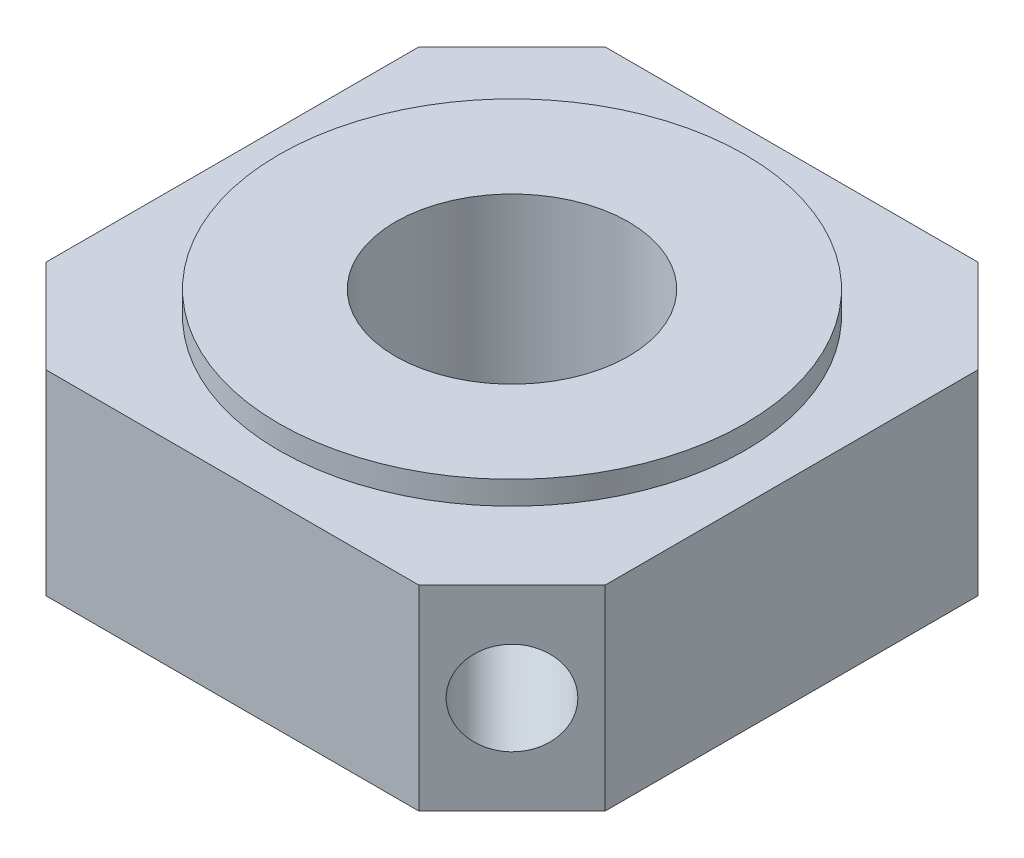
ISO-10303-21;
HEADER;
FILE_DESCRIPTION(('STEP AP214'),'2;1');
FILE_NAME('part.step','',(''),(''),'','','');
FILE_SCHEMA(('AUTOMOTIVE_DESIGN { 1 0 10303 214 1 1 1 1 }'));
ENDSEC;
DATA;
#1=APPLICATION_CONTEXT('core data for automotive mechanical design processes');
#2=APPLICATION_PROTOCOL_DEFINITION('international standard','automotive_design',2000,#1);
#3=PRODUCT_CONTEXT('',#1,'mechanical');
#4=PRODUCT('Part','Part','',(#3));
#5=PRODUCT_RELATED_PRODUCT_CATEGORY('part','',(#4));
#6=PRODUCT_DEFINITION_FORMATION('','',#4);
#7=PRODUCT_DEFINITION_CONTEXT('part definition',#1,'design');
#8=PRODUCT_DEFINITION('design','',#6,#7);
#9=PRODUCT_DEFINITION_SHAPE('','',#8);
#10=(LENGTH_UNIT() NAMED_UNIT(*) SI_UNIT(.MILLI.,.METRE.));
#11=(NAMED_UNIT(*) PLANE_ANGLE_UNIT() SI_UNIT($,.RADIAN.));
#12=(NAMED_UNIT(*) SI_UNIT($,.STERADIAN.) SOLID_ANGLE_UNIT());
#13=UNCERTAINTY_MEASURE_WITH_UNIT(LENGTH_MEASURE(1.E-05),#10,'distance_accuracy_value','');
#14=(GEOMETRIC_REPRESENTATION_CONTEXT(3) GLOBAL_UNCERTAINTY_ASSIGNED_CONTEXT((#13)) GLOBAL_UNIT_ASSIGNED_CONTEXT((#10,
#11,#12)) REPRESENTATION_CONTEXT('',''));
#15=CARTESIAN_POINT('',(0.,0.,0.));
#16=DIRECTION('',(0.,0.,1.));
#17=DIRECTION('',(1.,0.,0.));
#18=AXIS2_PLACEMENT_3D('',#15,#16,#17);
#19=CARTESIAN_POINT('',(-4.,4.2,-6.));
#20=DIRECTION('',(0.,0.,1.));
#21=DIRECTION('',(1.,0.,0.));
#22=AXIS2_PLACEMENT_3D('',#19,#20,#21);
#23=PLANE('',#22);
#24=DIRECTION('',(-1.,0.,0.));
#25=VECTOR('',#24,1.);
#26=CARTESIAN_POINT('',(-4.,0.,-6.));
#27=LINE('',#26,#25);
#28=CARTESIAN_POINT('',(4.,0.,-6.));
#29=VERTEX_POINT('',#28);
#30=CARTESIAN_POINT('',(-4.,0.,-6.));
#31=VERTEX_POINT('',#30);
#32=EDGE_CURVE('E142',#29,#31,#27,.T.);
#33=ORIENTED_EDGE('',*,*,#32,.T.);
#34=DIRECTION('',(0.,-1.,0.));
#35=VECTOR('',#34,1.);
#36=CARTESIAN_POINT('',(-4.,4.2,-6.));
#37=LINE('',#36,#35);
#38=CARTESIAN_POINT('',(-4.,4.2,-6.));
#39=VERTEX_POINT('',#38);
#40=EDGE_CURVE('E42',#39,#31,#37,.T.);
#41=ORIENTED_EDGE('',*,*,#40,.F.);
#42=DIRECTION('',(-1.,0.,0.));
#43=VECTOR('',#42,1.);
#44=CARTESIAN_POINT('',(-4.,4.2,-6.));
#45=LINE('',#44,#43);
#46=CARTESIAN_POINT('',(4.,4.2,-6.));
#47=VERTEX_POINT('',#46);
#48=EDGE_CURVE('E165',#47,#39,#45,.T.);
#49=ORIENTED_EDGE('',*,*,#48,.F.);
#50=DIRECTION('',(0.,-1.,0.));
#51=VECTOR('',#50,1.);
#52=CARTESIAN_POINT('',(4.,4.2,-6.));
#53=LINE('',#52,#51);
#54=EDGE_CURVE('E138',#47,#29,#53,.T.);
#55=ORIENTED_EDGE('',*,*,#54,.T.);
#56=EDGE_LOOP('',(#33,#41,#49,#55));
#57=FACE_BOUND('',#56,.T.);
#58=ADVANCED_FACE('F39',(#57),#23,.F.);
#59=CARTESIAN_POINT('',(-4.,4.2,-6.));
#60=DIRECTION('',(0.707106781186548,0.,0.707106781186548));
#61=DIRECTION('',(0.707106781186548,0.,-0.707106781186548));
#62=AXIS2_PLACEMENT_3D('',#59,#60,#61);
#63=PLANE('',#62);
#64=DIRECTION('',(-0.707106781186548,0.,0.707106781186548));
#65=VECTOR('',#64,1.);
#66=CARTESIAN_POINT('',(-4.,0.,-6.));
#67=LINE('',#66,#65);
#68=CARTESIAN_POINT('',(-6.,0.,-4.));
#69=VERTEX_POINT('',#68);
#70=EDGE_CURVE('E146',#31,#69,#67,.T.);
#71=ORIENTED_EDGE('',*,*,#70,.T.);
#72=DIRECTION('',(0.,-1.,0.));
#73=VECTOR('',#72,1.);
#74=CARTESIAN_POINT('',(-6.,4.2,-4.));
#75=LINE('',#74,#73);
#76=CARTESIAN_POINT('',(-6.,4.2,-4.));
#77=VERTEX_POINT('',#76);
#78=EDGE_CURVE('E179',#77,#69,#75,.T.);
#79=ORIENTED_EDGE('',*,*,#78,.F.);
#80=DIRECTION('',(-0.707106781186548,0.,0.707106781186548));
#81=VECTOR('',#80,1.);
#82=CARTESIAN_POINT('',(-4.,4.2,-6.));
#83=LINE('',#82,#81);
#84=EDGE_CURVE('E101',#39,#77,#83,.T.);
#85=ORIENTED_EDGE('',*,*,#84,.F.);
#86=ORIENTED_EDGE('',*,*,#40,.T.);
#87=EDGE_LOOP('',(#71,#79,#85,#86));
#88=FACE_BOUND('',#87,.T.);
#89=ADVANCED_FACE('F187',(#88),#63,.F.);
#90=CARTESIAN_POINT('',(-6.,4.2,4.));
#91=DIRECTION('',(1.,0.,0.));
#92=DIRECTION('',(0.,0.,-1.));
#93=AXIS2_PLACEMENT_3D('',#90,#91,#92);
#94=PLANE('',#93);
#95=DIRECTION('',(0.,0.,1.));
#96=VECTOR('',#95,1.);
#97=CARTESIAN_POINT('',(-6.,0.,4.));
#98=LINE('',#97,#96);
#99=CARTESIAN_POINT('',(-6.,0.,4.));
#100=VERTEX_POINT('',#99);
#101=EDGE_CURVE('E150',#69,#100,#98,.T.);
#102=ORIENTED_EDGE('',*,*,#101,.T.);
#103=DIRECTION('',(0.,-1.,0.));
#104=VECTOR('',#103,1.);
#105=CARTESIAN_POINT('',(-6.,4.2,4.));
#106=LINE('',#105,#104);
#107=CARTESIAN_POINT('',(-6.,4.2,4.));
#108=VERTEX_POINT('',#107);
#109=EDGE_CURVE('E176',#108,#100,#106,.T.);
#110=ORIENTED_EDGE('',*,*,#109,.F.);
#111=DIRECTION('',(0.,0.,1.));
#112=VECTOR('',#111,1.);
#113=CARTESIAN_POINT('',(-6.,4.2,4.));
#114=LINE('',#113,#112);
#115=EDGE_CURVE('E203',#77,#108,#114,.T.);
#116=ORIENTED_EDGE('',*,*,#115,.F.);
#117=ORIENTED_EDGE('',*,*,#78,.T.);
#118=EDGE_LOOP('',(#102,#110,#116,#117));
#119=FACE_BOUND('',#118,.T.);
#120=ADVANCED_FACE('F196',(#119),#94,.F.);
#121=CARTESIAN_POINT('',(-6.,4.2,4.));
#122=DIRECTION('',(0.707106781186548,0.,-0.707106781186547));
#123=DIRECTION('',(-0.707106781186547,0.,-0.707106781186548));
#124=AXIS2_PLACEMENT_3D('',#121,#122,#123);
#125=PLANE('',#124);
#126=DIRECTION('',(0.707106781186547,0.,0.707106781186548));
#127=VECTOR('',#126,1.);
#128=CARTESIAN_POINT('',(-6.,0.,4.));
#129=LINE('',#128,#127);
#130=CARTESIAN_POINT('',(-4.00000000000001,0.,6.));
#131=VERTEX_POINT('',#130);
#132=EDGE_CURVE('E153',#100,#131,#129,.T.);
#133=ORIENTED_EDGE('',*,*,#132,.T.);
#134=DIRECTION('',(0.,-1.,0.));
#135=VECTOR('',#134,1.);
#136=CARTESIAN_POINT('',(-4.00000000000001,4.2,6.));
#137=LINE('',#136,#135);
#138=CARTESIAN_POINT('',(-4.00000000000001,4.2,6.));
#139=VERTEX_POINT('',#138);
#140=EDGE_CURVE('E172',#139,#131,#137,.T.);
#141=ORIENTED_EDGE('',*,*,#140,.F.);
#142=DIRECTION('',(0.707106781186547,0.,0.707106781186548));
#143=VECTOR('',#142,1.);
#144=CARTESIAN_POINT('',(-6.,4.2,4.));
#145=LINE('',#144,#143);
#146=EDGE_CURVE('E201',#108,#139,#145,.T.);
#147=ORIENTED_EDGE('',*,*,#146,.F.);
#148=ORIENTED_EDGE('',*,*,#109,.T.);
#149=EDGE_LOOP('',(#133,#141,#147,#148));
#150=FACE_BOUND('',#149,.T.);
#151=ADVANCED_FACE('F199',(#150),#125,.F.);
#152=CARTESIAN_POINT('',(-4.00000000000001,4.2,6.));
#153=DIRECTION('',(0.,0.,-1.));
#154=DIRECTION('',(-1.,0.,0.));
#155=AXIS2_PLACEMENT_3D('',#152,#153,#154);
#156=PLANE('',#155);
#157=DIRECTION('',(1.,0.,0.));
#158=VECTOR('',#157,1.);
#159=CARTESIAN_POINT('',(-4.00000000000001,0.,6.));
#160=LINE('',#159,#158);
#161=CARTESIAN_POINT('',(4.,0.,6.));
#162=VERTEX_POINT('',#161);
#163=EDGE_CURVE('E156',#131,#162,#160,.T.);
#164=ORIENTED_EDGE('',*,*,#163,.T.);
#165=DIRECTION('',(0.,-1.,0.));
#166=VECTOR('',#165,1.);
#167=CARTESIAN_POINT('',(4.,4.2,6.));
#168=LINE('',#167,#166);
#169=CARTESIAN_POINT('',(4.,4.2,6.));
#170=VERTEX_POINT('',#169);
#171=EDGE_CURVE('E131',#170,#162,#168,.T.);
#172=ORIENTED_EDGE('',*,*,#171,.F.);
#173=DIRECTION('',(1.,0.,0.));
#174=VECTOR('',#173,1.);
#175=CARTESIAN_POINT('',(-4.00000000000001,4.2,6.));
#176=LINE('',#175,#174);
#177=EDGE_CURVE('E120',#139,#170,#176,.T.);
#178=ORIENTED_EDGE('',*,*,#177,.F.);
#179=ORIENTED_EDGE('',*,*,#140,.T.);
#180=EDGE_LOOP('',(#164,#172,#178,#179));
#181=FACE_BOUND('',#180,.T.);
#182=ADVANCED_FACE('F267',(#181),#156,.F.);
#183=CARTESIAN_POINT('',(6.,4.2,4.));
#184=DIRECTION('',(-0.707106781186547,0.,-0.707106781186548));
#185=DIRECTION('',(-0.707106781186548,0.,0.707106781186547));
#186=AXIS2_PLACEMENT_3D('',#183,#184,#185);
#187=PLANE('',#186);
#188=CARTESIAN_POINT('',(4.99999999999999,2.1,5.));
#189=DIRECTION('',(0.707106781186547,0.,0.707106781186548));
#190=DIRECTION('',(0.707106781186548,0.,-0.707106781186547));
#191=AXIS2_PLACEMENT_3D('',#188,#189,#190);
#192=CIRCLE('',#191,1.);
#193=CARTESIAN_POINT('',(5.70710678118654,2.1,4.29289321881346));
#194=VERTEX_POINT('',#193);
#195=EDGE_CURVE('E224',#194,#194,#192,.T.);
#196=ORIENTED_EDGE('',*,*,#195,.F.);
#197=EDGE_LOOP('',(#196));
#198=FACE_BOUND('',#197,.T.);
#199=DIRECTION('',(0.707106781186548,0.,-0.707106781186547));
#200=VECTOR('',#199,1.);
#201=CARTESIAN_POINT('',(6.,0.,4.));
#202=LINE('',#201,#200);
#203=CARTESIAN_POINT('',(6.,0.,4.));
#204=VERTEX_POINT('',#203);
#205=EDGE_CURVE('E129',#162,#204,#202,.T.);
#206=ORIENTED_EDGE('',*,*,#205,.T.);
#207=DIRECTION('',(0.,-1.,0.));
#208=VECTOR('',#207,1.);
#209=CARTESIAN_POINT('',(6.,4.2,4.));
#210=LINE('',#209,#208);
#211=CARTESIAN_POINT('',(6.,4.2,4.));
#212=VERTEX_POINT('',#211);
#213=EDGE_CURVE('E126',#212,#204,#210,.T.);
#214=ORIENTED_EDGE('',*,*,#213,.F.);
#215=DIRECTION('',(0.707106781186548,0.,-0.707106781186547));
#216=VECTOR('',#215,1.);
#217=CARTESIAN_POINT('',(6.,4.2,4.));
#218=LINE('',#217,#216);
#219=EDGE_CURVE('E114',#170,#212,#218,.T.);
#220=ORIENTED_EDGE('',*,*,#219,.F.);
#221=ORIENTED_EDGE('',*,*,#171,.T.);
#222=EDGE_LOOP('',(#206,#214,#220,#221));
#223=FACE_BOUND('',#222,.T.);
#224=ADVANCED_FACE('F127',(#198,#223),#187,.F.);
#225=CARTESIAN_POINT('',(6.,4.2,4.));
#226=DIRECTION('',(-1.,0.,0.));
#227=DIRECTION('',(0.,0.,1.));
#228=AXIS2_PLACEMENT_3D('',#225,#226,#227);
#229=PLANE('',#228);
#230=DIRECTION('',(0.,0.,-1.));
#231=VECTOR('',#230,1.);
#232=CARTESIAN_POINT('',(6.,0.,4.));
#233=LINE('',#232,#231);
#234=CARTESIAN_POINT('',(6.,0.,-4.));
#235=VERTEX_POINT('',#234);
#236=EDGE_CURVE('E86',#204,#235,#233,.T.);
#237=ORIENTED_EDGE('',*,*,#236,.T.);
#238=DIRECTION('',(0.,-1.,0.));
#239=VECTOR('',#238,1.);
#240=CARTESIAN_POINT('',(6.,4.2,-4.));
#241=LINE('',#240,#239);
#242=CARTESIAN_POINT('',(6.,4.2,-4.));
#243=VERTEX_POINT('',#242);
#244=EDGE_CURVE('E132',#243,#235,#241,.T.);
#245=ORIENTED_EDGE('',*,*,#244,.F.);
#246=DIRECTION('',(0.,0.,-1.));
#247=VECTOR('',#246,1.);
#248=CARTESIAN_POINT('',(6.,4.2,4.));
#249=LINE('',#248,#247);
#250=EDGE_CURVE('E118',#212,#243,#249,.T.);
#251=ORIENTED_EDGE('',*,*,#250,.F.);
#252=ORIENTED_EDGE('',*,*,#213,.T.);
#253=EDGE_LOOP('',(#237,#245,#251,#252));
#254=FACE_BOUND('',#253,.T.);
#255=ADVANCED_FACE('F134',(#254),#229,.F.);
#256=CARTESIAN_POINT('',(4.,4.2,-6.));
#257=DIRECTION('',(-0.707106781186547,0.,0.707106781186548));
#258=DIRECTION('',(0.707106781186548,0.,0.707106781186547));
#259=AXIS2_PLACEMENT_3D('',#256,#257,#258);
#260=PLANE('',#259);
#261=DIRECTION('',(-0.707106781186548,0.,-0.707106781186547));
#262=VECTOR('',#261,1.);
#263=CARTESIAN_POINT('',(4.,0.,-6.));
#264=LINE('',#263,#262);
#265=EDGE_CURVE('E92',#235,#29,#264,.T.);
#266=ORIENTED_EDGE('',*,*,#265,.T.);
#267=ORIENTED_EDGE('',*,*,#54,.F.);
#268=DIRECTION('',(-0.707106781186548,0.,-0.707106781186547));
#269=VECTOR('',#268,1.);
#270=CARTESIAN_POINT('',(4.,4.2,-6.));
#271=LINE('',#270,#269);
#272=EDGE_CURVE('E57',#243,#47,#271,.T.);
#273=ORIENTED_EDGE('',*,*,#272,.F.);
#274=ORIENTED_EDGE('',*,*,#244,.T.);
#275=EDGE_LOOP('',(#266,#267,#273,#274));
#276=FACE_BOUND('',#275,.T.);
#277=ADVANCED_FACE('F256',(#276),#260,.F.);
#278=CARTESIAN_POINT('',(0.,4.2,0.));
#279=DIRECTION('',(0.,1.,0.));
#280=DIRECTION('',(0.,0.,1.));
#281=AXIS2_PLACEMENT_3D('',#278,#279,#280);
#282=PLANE('',#281);
#283=CARTESIAN_POINT('',(0.,4.2,0.));
#284=DIRECTION('',(0.,1.,0.));
#285=DIRECTION('',(0.,0.,1.));
#286=AXIS2_PLACEMENT_3D('',#283,#284,#285);
#287=CIRCLE('',#286,5.);
#288=CARTESIAN_POINT('',(0.,4.2,5.));
#289=VERTEX_POINT('',#288);
#290=EDGE_CURVE('E11',#289,#289,#287,.T.);
#291=ORIENTED_EDGE('',*,*,#290,.F.);
#292=EDGE_LOOP('',(#291));
#293=FACE_BOUND('',#292,.T.);
#294=ORIENTED_EDGE('',*,*,#48,.T.);
#295=ORIENTED_EDGE('',*,*,#84,.T.);
#296=ORIENTED_EDGE('',*,*,#115,.T.);
#297=ORIENTED_EDGE('',*,*,#146,.T.);
#298=ORIENTED_EDGE('',*,*,#177,.T.);
#299=ORIENTED_EDGE('',*,*,#219,.T.);
#300=ORIENTED_EDGE('',*,*,#250,.T.);
#301=ORIENTED_EDGE('',*,*,#272,.T.);
#302=EDGE_LOOP('',(#294,#295,#296,#297,#298,#299,#300,#301));
#303=FACE_BOUND('',#302,.T.);
#304=ADVANCED_FACE('F116',(#293,#303),#282,.T.);
#305=CARTESIAN_POINT('',(0.,0.,0.));
#306=DIRECTION('',(0.,1.,0.));
#307=DIRECTION('',(0.,0.,1.));
#308=AXIS2_PLACEMENT_3D('',#305,#306,#307);
#309=PLANE('',#308);
#310=CARTESIAN_POINT('',(0.,0.,0.));
#311=DIRECTION('',(0.,1.,0.));
#312=DIRECTION('',(0.,0.,1.));
#313=AXIS2_PLACEMENT_3D('',#310,#311,#312);
#314=CIRCLE('',#313,2.5);
#315=CARTESIAN_POINT('',(0.,0.,2.5));
#316=VERTEX_POINT('',#315);
#317=EDGE_CURVE('E216',#316,#316,#314,.F.);
#318=ORIENTED_EDGE('',*,*,#317,.F.);
#319=EDGE_LOOP('',(#318));
#320=FACE_BOUND('',#319,.T.);
#321=ORIENTED_EDGE('',*,*,#32,.F.);
#322=ORIENTED_EDGE('',*,*,#265,.F.);
#323=ORIENTED_EDGE('',*,*,#236,.F.);
#324=ORIENTED_EDGE('',*,*,#205,.F.);
#325=ORIENTED_EDGE('',*,*,#163,.F.);
#326=ORIENTED_EDGE('',*,*,#132,.F.);
#327=ORIENTED_EDGE('',*,*,#101,.F.);
#328=ORIENTED_EDGE('',*,*,#70,.F.);
#329=EDGE_LOOP('',(#321,#322,#323,#324,#325,#326,#327,#328));
#330=FACE_BOUND('',#329,.T.);
#331=ADVANCED_FACE('F192',(#320,#330),#309,.F.);
#332=CARTESIAN_POINT('',(0.,4.7,0.));
#333=DIRECTION('',(0.,-1.,0.));
#334=DIRECTION('',(0.,0.,-1.));
#335=AXIS2_PLACEMENT_3D('',#332,#333,#334);
#336=CYLINDRICAL_SURFACE('',#335,5.);
#337=CARTESIAN_POINT('',(0.,4.7,0.));
#338=DIRECTION('',(0.,1.,0.));
#339=DIRECTION('',(0.,0.,1.));
#340=AXIS2_PLACEMENT_3D('',#337,#338,#339);
#341=CIRCLE('',#340,5.);
#342=CARTESIAN_POINT('',(0.,4.7,5.));
#343=VERTEX_POINT('',#342);
#344=EDGE_CURVE('E147',#343,#343,#341,.T.);
#345=ORIENTED_EDGE('',*,*,#344,.F.);
#346=EDGE_LOOP('',(#345));
#347=FACE_BOUND('',#346,.T.);
#348=ORIENTED_EDGE('',*,*,#290,.T.);
#349=EDGE_LOOP('',(#348));
#350=FACE_BOUND('',#349,.T.);
#351=ADVANCED_FACE('F249',(#347,#350),#336,.T.);
#352=CARTESIAN_POINT('',(0.,4.7,0.));
#353=DIRECTION('',(0.,1.,0.));
#354=DIRECTION('',(0.,0.,1.));
#355=AXIS2_PLACEMENT_3D('',#352,#353,#354);
#356=PLANE('',#355);
#357=CARTESIAN_POINT('',(0.,4.7,0.));
#358=DIRECTION('',(0.,1.,0.));
#359=DIRECTION('',(0.,0.,1.));
#360=AXIS2_PLACEMENT_3D('',#357,#358,#359);
#361=CIRCLE('',#360,2.5);
#362=CARTESIAN_POINT('',(0.,4.7,2.5));
#363=VERTEX_POINT('',#362);
#364=EDGE_CURVE('E220',#363,#363,#361,.T.);
#365=ORIENTED_EDGE('',*,*,#364,.F.);
#366=EDGE_LOOP('',(#365));
#367=FACE_BOUND('',#366,.T.);
#368=ORIENTED_EDGE('',*,*,#344,.T.);
#369=EDGE_LOOP('',(#368));
#370=FACE_BOUND('',#369,.T.);
#371=ADVANCED_FACE('F245',(#367,#370),#356,.T.);
#372=CARTESIAN_POINT('',(0.,-0.00100000000000013,0.));
#373=DIRECTION('',(0.,1.,0.));
#374=DIRECTION('',(0.,0.,1.));
#375=AXIS2_PLACEMENT_3D('',#372,#373,#374);
#376=CYLINDRICAL_SURFACE('',#375,2.5);
#377=CARTESIAN_POINT('',(2.32729195578851,2.1,0.91307839341542));
#378=CARTESIAN_POINT('',(2.32729162903877,2.04643025095005,0.913086372197829));
#379=CARTESIAN_POINT('',(2.32557727434015,1.99278473264765,0.9174873849653));
#380=CARTESIAN_POINT('',(2.31866612899198,1.88703258356147,0.934809346209684));
#381=CARTESIAN_POINT('',(2.31346043921772,1.83493024145976,0.94775206544059));
#382=CARTESIAN_POINT('',(2.29945453908956,1.73397352901497,0.981241305834712));
#383=CARTESIAN_POINT('',(2.29066786250608,1.68510772631987,1.00175917076173));
#384=CARTESIAN_POINT('',(2.26930609743052,1.59155747457019,1.04924972456114));
#385=CARTESIAN_POINT('',(2.25673183603043,1.54687211542457,1.07622100394221));
#386=CARTESIAN_POINT('',(2.22679614758076,1.46036979887927,1.13691692735816));
#387=CARTESIAN_POINT('',(2.20922027039163,1.41882178853527,1.17091926918829));
#388=CARTESIAN_POINT('',(2.16934480011139,1.34223550134231,1.24324061003679));
#389=CARTESIAN_POINT('',(2.14704356209437,1.30719949935507,1.28156111005099));
#390=CARTESIAN_POINT('',(2.09658588603624,1.24329680150865,1.36260458506882));
#391=CARTESIAN_POINT('',(2.06823324216738,1.21472784926468,1.40544157438036));
#392=CARTESIAN_POINT('',(2.00636762020157,1.1665782158051,1.49242450565847));
#393=CARTESIAN_POINT('',(1.97285674936222,1.14699387710902,1.53656990718783));
#394=CARTESIAN_POINT('',(1.90294797763429,1.1183292567813,1.62225032531312));
#395=CARTESIAN_POINT('',(1.86676839094165,1.10878634295549,1.66380824938923));
#396=CARTESIAN_POINT('',(1.79112602588949,1.09898575716865,1.74497576232666));
#397=CARTESIAN_POINT('',(1.75166447758922,1.09872462203258,1.78458607236398));
#398=CARTESIAN_POINT('',(1.67301009529357,1.10724138488749,1.85843647055424));
#399=CARTESIAN_POINT('',(1.63392667055512,1.11551238637347,1.89285323059997));
#400=CARTESIAN_POINT('',(1.55521765683261,1.13999643815538,1.95803737542052));
#401=CARTESIAN_POINT('',(1.51559202827459,1.15621007120019,1.98880449221617));
#402=CARTESIAN_POINT('',(1.43651228292825,1.19631824143815,2.04667326672174));
#403=CARTESIAN_POINT('',(1.39706975184766,1.22032485740777,2.07371269237632));
#404=CARTESIAN_POINT('',(1.32028775582878,1.27523250345951,2.1234254013444));
#405=CARTESIAN_POINT('',(1.28294901720696,1.30613589654881,2.14609718322212));
#406=CARTESIAN_POINT('',(1.20931082645381,1.3763245679733,2.18849025510281));
#407=CARTESIAN_POINT('',(1.17324055864672,1.41602694629192,2.20792010366413));
#408=CARTESIAN_POINT('',(1.10644858652432,1.50149528591048,2.24213803125728));
#409=CARTESIAN_POINT('',(1.07572863355171,1.54726322407708,2.25692459164772));
#410=CARTESIAN_POINT('',(1.02037799044731,1.64520951120448,2.28249584607571));
#411=CARTESIAN_POINT('',(0.995943811114341,1.69753241524191,2.2931557036778));
#412=CARTESIAN_POINT('',(0.955902176531977,1.80610774523101,2.31013629712162));
#413=CARTESIAN_POINT('',(0.94028898873173,1.86235759238542,2.31645985159534));
#414=CARTESIAN_POINT('',(0.919713513257696,1.97351788871803,2.32470283148895));
#415=CARTESIAN_POINT('',(0.914158807575557,2.02830022356008,2.32686771517217));
#416=CARTESIAN_POINT('',(0.912285711640354,2.13803860388398,2.3276032985332));
#417=CARTESIAN_POINT('',(0.915964520480345,2.19299459163892,2.32617508814477));
#418=CARTESIAN_POINT('',(0.931799700874137,2.29822946747744,2.31987357247136));
#419=CARTESIAN_POINT('',(0.943461294302817,2.34859646869975,2.31520111750759));
#420=CARTESIAN_POINT('',(0.9740029358595,2.446644202393,2.30251811694614));
#421=CARTESIAN_POINT('',(0.992884584515163,2.49432433655366,2.29450683116759));
#422=CARTESIAN_POINT('',(1.03775068250395,2.58780117889774,2.27457635439636));
#423=CARTESIAN_POINT('',(1.06399212191009,2.63344309434723,2.26251185991939));
#424=CARTESIAN_POINT('',(1.12194463112471,2.71974149372083,2.23434042925442));
#425=CARTESIAN_POINT('',(1.15365792773305,2.7603959363978,2.21823184608499));
#426=CARTESIAN_POINT('',(1.22377731345795,2.83868670429961,2.18038262942619));
#427=CARTESIAN_POINT('',(1.262504737055,2.87587828264552,2.15831387306644));
#428=CARTESIAN_POINT('',(1.3431897463675,2.94258853830517,2.10904552811477));
#429=CARTESIAN_POINT('',(1.38514746347445,2.97210690329862,2.0818457307535));
#430=CARTESIAN_POINT('',(1.47062556026588,3.02252381323061,2.02236679282232));
#431=CARTESIAN_POINT('',(1.51414556307261,3.04342442208289,1.99008887100173));
#432=CARTESIAN_POINT('',(1.60100767813844,3.07577442620382,1.92089825404276));
#433=CARTESIAN_POINT('',(1.64434987420739,3.08722895072003,1.88398808678795));
#434=CARTESIAN_POINT('',(1.72639186247268,3.09975235081269,1.8089936090931));
#435=CARTESIAN_POINT('',(1.76521004595574,3.10145006423132,1.77114302016578));
#436=CARTESIAN_POINT('',(1.83999588109811,3.09607226035795,1.6933180092036));
#437=CARTESIAN_POINT('',(1.87596396337766,3.08899807110719,1.65334390953917));
#438=CARTESIAN_POINT('',(1.9430891421967,3.06672660582076,1.5738585564921));
#439=CARTESIAN_POINT('',(1.97436008237009,3.05178552696222,1.53437080408581));
#440=CARTESIAN_POINT('',(2.03288668206195,3.01447359771909,1.45594245209021));
#441=CARTESIAN_POINT('',(2.0601415996639,2.99210137698983,1.41700195479935));
#442=CARTESIAN_POINT('',(2.11155660798318,2.93944840075533,1.33925243065415));
#443=CARTESIAN_POINT('',(2.13552671420896,2.90886185255746,1.30052525599576));
#444=CARTESIAN_POINT('',(2.17893118280061,2.84110574041053,1.22642014460658));
#445=CARTESIAN_POINT('',(2.19836366008855,2.80393345176994,1.19104360345206));
#446=CARTESIAN_POINT('',(2.23395499406661,2.72134238773748,1.12294792491542));
#447=CARTESIAN_POINT('',(2.24983672288318,2.67555556329945,1.09052887092914));
#448=CARTESIAN_POINT('',(2.27700551619095,2.57852893128562,1.0326054501314));
#449=CARTESIAN_POINT('',(2.28829204052953,2.52728848354507,1.00710189633406));
#450=CARTESIAN_POINT('',(2.30572662636221,2.42548139907597,0.966472684761525));
#451=CARTESIAN_POINT('',(2.31224507892087,2.37526738262441,0.95062080561597));
#452=CARTESIAN_POINT('',(2.32184797564736,2.27275729018483,0.92692587172686));
#453=CARTESIAN_POINT('',(2.32494199022358,2.22046744201652,0.919060501891845));
#454=CARTESIAN_POINT('',(2.32698547836092,2.14531121883104,0.913857849350856));
#455=CARTESIAN_POINT('',(2.32729209401821,2.1226623895012,0.913075018035137));
#456=CARTESIAN_POINT('',(2.32729195578851,2.1,0.91307839341542));
#457=B_SPLINE_CURVE_WITH_KNOTS('',3,(#377,#378,#379,#380,#381,#382,#383,#384,#385,#386,#387,
#388,#389,#390,#391,#392,#393,#394,#395,#396,#397,#398,#399,#400,#401,#402,#403,#404,#405,#406,
#407,#408,#409,#410,#411,#412,#413,#414,#415,#416,#417,#418,#419,#420,#421,#422,#423,#424,#425,
#426,#427,#428,#429,#430,#431,#432,#433,#434,#435,#436,#437,#438,#439,#440,#441,#442,#443,#444,
#445,#446,#447,#448,#449,#450,#451,#452,#453,#454,#455,#456),.UNSPECIFIED.,.T.,.F.,(4,2,2,2,2,2,
2,2,2,2,2,2,2,2,2,2,2,2,2,2,2,2,2,2,2,2,2,2,2,2,2,2,2,2,2,2,2,2,2,4),(0.,0.160638824383827,
0.321688667911123,0.482135411646696,0.642547144119308,0.811278091422125,0.980067871741712,
1.15551334545714,1.3308873348474,1.49777091443592,1.66459222652836,1.82204322415151,
1.9795057756453,2.13934150117449,2.29923207470016,2.46962022040678,2.64006403563564,
2.81532229357288,2.99046652397056,3.15491073759215,3.31930507450975,3.47433624039577,
3.62940179322824,3.79075577323356,3.9521755725993,4.12551867120495,4.29886882423379,
4.47217743653411,4.64539187974073,4.80730519874982,4.96919400753306,5.12610997218681,
5.28305488911298,5.44693525566968,5.61088358279108,5.78498126639812,5.95909940876599,
6.11758330406543,6.27562315106627,6.34358052760367),.UNSPECIFIED.);
#458=CARTESIAN_POINT('',(2.32729195578851,2.1,0.91307839341542));
#459=VERTEX_POINT('',#458);
#460=EDGE_CURVE('E228',#459,#459,#457,.T.);
#461=ORIENTED_EDGE('',*,*,#460,.F.);
#462=EDGE_LOOP('',(#461));
#463=FACE_BOUND('',#462,.T.);
#464=ORIENTED_EDGE('',*,*,#364,.T.);
#465=EDGE_LOOP('',(#464));
#466=FACE_BOUND('',#465,.T.);
#467=ORIENTED_EDGE('',*,*,#317,.T.);
#468=EDGE_LOOP('',(#467));
#469=FACE_BOUND('',#468,.T.);
#470=ADVANCED_FACE('F241',(#463,#466,#469),#376,.F.);
#471=CARTESIAN_POINT('',(-6.00099999999999,2.1,-6.001));
#472=DIRECTION('',(0.707106781186547,0.,0.707106781186548));
#473=DIRECTION('',(0.707106781186548,0.,-0.707106781186547));
#474=AXIS2_PLACEMENT_3D('',#471,#472,#473);
#475=CYLINDRICAL_SURFACE('',#474,1.);
#476=ORIENTED_EDGE('',*,*,#195,.T.);
#477=EDGE_LOOP('',(#476));
#478=FACE_BOUND('',#477,.T.);
#479=ORIENTED_EDGE('',*,*,#460,.T.);
#480=EDGE_LOOP('',(#479));
#481=FACE_BOUND('',#480,.T.);
#482=ADVANCED_FACE('F236',(#478,#481),#475,.F.);
#483=CLOSED_SHELL('',(#58,#89,#120,#151,#182,#224,#255,#277,#304,#331,#351,#371,#470,#482));
#484=MANIFOLD_SOLID_BREP('B2',#483);
#485=ADVANCED_BREP_SHAPE_REPRESENTATION('',(#18,#484),#14);
#486=SHAPE_DEFINITION_REPRESENTATION(#9,#485);
ENDSEC;
END-ISO-10303-21;
